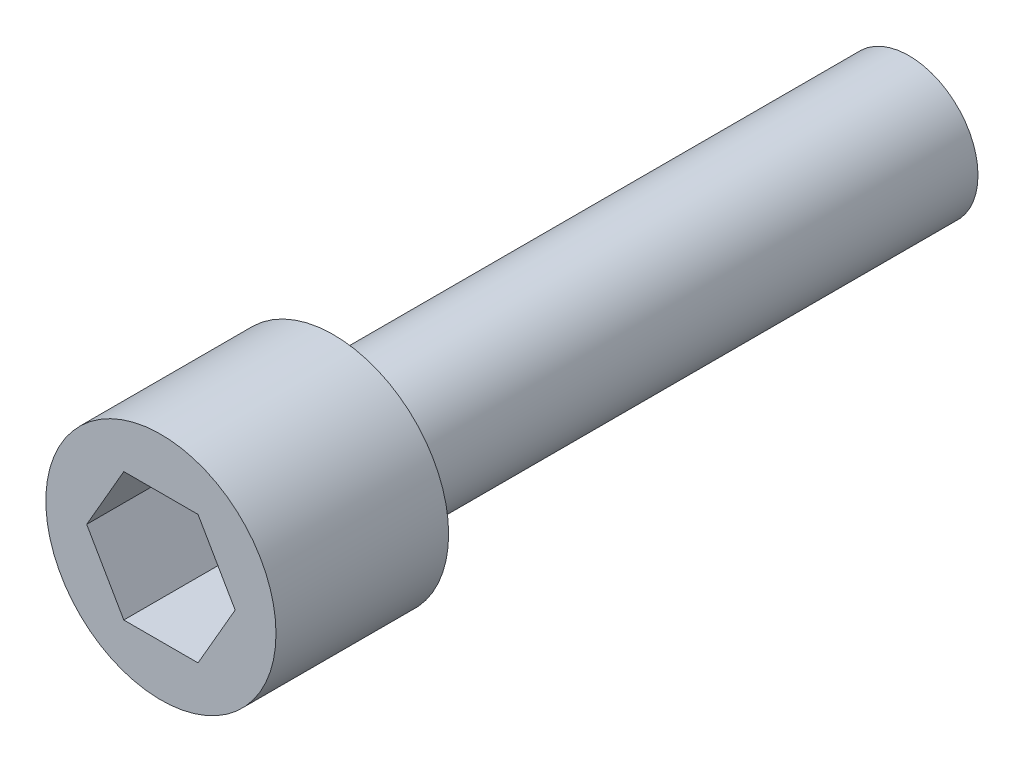
ISO-10303-21;
HEADER;
FILE_DESCRIPTION(('STEP AP214'),'2;1');
FILE_NAME('part.step','',(''),(''),'','','');
FILE_SCHEMA(('AUTOMOTIVE_DESIGN { 1 0 10303 214 1 1 1 1 }'));
ENDSEC;
DATA;
#1=APPLICATION_CONTEXT('core data for automotive mechanical design processes');
#2=APPLICATION_PROTOCOL_DEFINITION('international standard','automotive_design',2000,#1);
#3=PRODUCT_CONTEXT('',#1,'mechanical');
#4=PRODUCT('Part','Part','',(#3));
#5=PRODUCT_RELATED_PRODUCT_CATEGORY('part','',(#4));
#6=PRODUCT_DEFINITION_FORMATION('','',#4);
#7=PRODUCT_DEFINITION_CONTEXT('part definition',#1,'design');
#8=PRODUCT_DEFINITION('design','',#6,#7);
#9=PRODUCT_DEFINITION_SHAPE('','',#8);
#10=(LENGTH_UNIT() NAMED_UNIT(*) SI_UNIT(.MILLI.,.METRE.));
#11=(NAMED_UNIT(*) PLANE_ANGLE_UNIT() SI_UNIT($,.RADIAN.));
#12=(NAMED_UNIT(*) SI_UNIT($,.STERADIAN.) SOLID_ANGLE_UNIT());
#13=UNCERTAINTY_MEASURE_WITH_UNIT(LENGTH_MEASURE(1.E-05),#10,'distance_accuracy_value','');
#14=(GEOMETRIC_REPRESENTATION_CONTEXT(3) GLOBAL_UNCERTAINTY_ASSIGNED_CONTEXT((#13)) GLOBAL_UNIT_ASSIGNED_CONTEXT((#10,
#11,#12)) REPRESENTATION_CONTEXT('',''));
#15=CARTESIAN_POINT('',(0.,0.,0.));
#16=DIRECTION('',(0.,0.,1.));
#17=DIRECTION('',(1.,0.,0.));
#18=AXIS2_PLACEMENT_3D('',#15,#16,#17);
#19=CARTESIAN_POINT('',(-15.,15.,-10.));
#20=DIRECTION('',(0.,0.,1.));
#21=DIRECTION('',(1.,0.,0.));
#22=AXIS2_PLACEMENT_3D('',#19,#20,#21);
#23=CYLINDRICAL_SURFACE('',#22,1.2);
#24=CARTESIAN_POINT('',(-15.,15.,-10.));
#25=DIRECTION('',(0.,0.,1.));
#26=DIRECTION('',(1.,0.,0.));
#27=AXIS2_PLACEMENT_3D('',#24,#25,#26);
#28=CIRCLE('',#27,1.2);
#29=CARTESIAN_POINT('',(-13.8,15.,-10.));
#30=VERTEX_POINT('',#29);
#31=EDGE_CURVE('E11',#30,#30,#28,.T.);
#32=ORIENTED_EDGE('',*,*,#31,.T.);
#33=EDGE_LOOP('',(#32));
#34=FACE_BOUND('',#33,.T.);
#35=CARTESIAN_POINT('',(-15.,15.,0.));
#36=DIRECTION('',(0.,0.,1.));
#37=DIRECTION('',(1.,0.,0.));
#38=AXIS2_PLACEMENT_3D('',#35,#36,#37);
#39=CIRCLE('',#38,1.2);
#40=CARTESIAN_POINT('',(-13.8,15.,0.));
#41=VERTEX_POINT('',#40);
#42=EDGE_CURVE('E38',#41,#41,#39,.T.);
#43=ORIENTED_EDGE('',*,*,#42,.F.);
#44=EDGE_LOOP('',(#43));
#45=FACE_BOUND('',#44,.T.);
#46=ADVANCED_FACE('F35',(#34,#45),#23,.T.);
#47=CARTESIAN_POINT('',(-15.,15.,-10.));
#48=DIRECTION('',(0.,0.,1.));
#49=DIRECTION('',(1.,0.,0.));
#50=AXIS2_PLACEMENT_3D('',#47,#48,#49);
#51=PLANE('',#50);
#52=ORIENTED_EDGE('',*,*,#31,.F.);
#53=EDGE_LOOP('',(#52));
#54=FACE_BOUND('',#53,.T.);
#55=ADVANCED_FACE('F167',(#54),#51,.F.);
#56=CARTESIAN_POINT('',(-15.,15.,3.));
#57=DIRECTION('',(0.,0.,-1.));
#58=DIRECTION('',(-1.,0.,0.));
#59=AXIS2_PLACEMENT_3D('',#56,#57,#58);
#60=CYLINDRICAL_SURFACE('',#59,2.);
#61=CARTESIAN_POINT('',(-15.,15.,3.));
#62=DIRECTION('',(0.,0.,1.));
#63=DIRECTION('',(1.,0.,0.));
#64=AXIS2_PLACEMENT_3D('',#61,#62,#63);
#65=CIRCLE('',#64,2.);
#66=CARTESIAN_POINT('',(-13.,15.,3.));
#67=VERTEX_POINT('',#66);
#68=EDGE_CURVE('E142',#67,#67,#65,.T.);
#69=ORIENTED_EDGE('',*,*,#68,.F.);
#70=EDGE_LOOP('',(#69));
#71=FACE_BOUND('',#70,.T.);
#72=CARTESIAN_POINT('',(-15.,15.,0.));
#73=DIRECTION('',(0.,0.,1.));
#74=DIRECTION('',(1.,0.,0.));
#75=AXIS2_PLACEMENT_3D('',#72,#73,#74);
#76=CIRCLE('',#75,2.);
#77=CARTESIAN_POINT('',(-13.,15.,0.));
#78=VERTEX_POINT('',#77);
#79=EDGE_CURVE('E136',#78,#78,#76,.T.);
#80=ORIENTED_EDGE('',*,*,#79,.T.);
#81=EDGE_LOOP('',(#80));
#82=FACE_BOUND('',#81,.T.);
#83=ADVANCED_FACE('F148',(#71,#82),#60,.T.);
#84=CARTESIAN_POINT('',(-15.,15.,3.));
#85=DIRECTION('',(0.,0.,1.));
#86=DIRECTION('',(1.,0.,0.));
#87=AXIS2_PLACEMENT_3D('',#84,#85,#86);
#88=PLANE('',#87);
#89=DIRECTION('',(0.499999999999995,0.866025403784442,0.));
#90=VECTOR('',#89,1.);
#91=CARTESIAN_POINT('',(-14.3549738433214,13.8827819244218,3.));
#92=LINE('',#91,#90);
#93=CARTESIAN_POINT('',(-14.3549738433214,13.8827819244218,3.));
#94=VERTEX_POINT('',#93);
#95=CARTESIAN_POINT('',(-13.7099476866428,15.,3.));
#96=VERTEX_POINT('',#95);
#97=EDGE_CURVE('E49',#94,#96,#92,.T.);
#98=ORIENTED_EDGE('',*,*,#97,.F.);
#99=DIRECTION('',(1.,0.,0.));
#100=VECTOR('',#99,1.);
#101=CARTESIAN_POINT('',(-15.6450261566786,13.8827819244218,3.));
#102=LINE('',#101,#100);
#103=CARTESIAN_POINT('',(-15.6450261566786,13.8827819244218,3.));
#104=VERTEX_POINT('',#103);
#105=EDGE_CURVE('E132',#104,#94,#102,.T.);
#106=ORIENTED_EDGE('',*,*,#105,.F.);
#107=DIRECTION('',(0.500000000000006,-0.866025403784435,0.));
#108=VECTOR('',#107,1.);
#109=CARTESIAN_POINT('',(-16.2900523133572,15.,3.));
#110=LINE('',#109,#108);
#111=CARTESIAN_POINT('',(-16.2900523133572,15.,3.));
#112=VERTEX_POINT('',#111);
#113=EDGE_CURVE('E130',#112,#104,#110,.T.);
#114=ORIENTED_EDGE('',*,*,#113,.F.);
#115=DIRECTION('',(-0.499999999999995,-0.866025403784442,0.));
#116=VECTOR('',#115,1.);
#117=CARTESIAN_POINT('',(-15.6450261566786,16.1172180755782,3.));
#118=LINE('',#117,#116);
#119=CARTESIAN_POINT('',(-15.6450261566786,16.1172180755782,3.));
#120=VERTEX_POINT('',#119);
#121=EDGE_CURVE('E97',#120,#112,#118,.T.);
#122=ORIENTED_EDGE('',*,*,#121,.F.);
#123=DIRECTION('',(-1.,0.,0.));
#124=VECTOR('',#123,1.);
#125=CARTESIAN_POINT('',(-14.3549738433214,16.1172180755782,3.));
#126=LINE('',#125,#124);
#127=CARTESIAN_POINT('',(-14.3549738433214,16.1172180755782,3.));
#128=VERTEX_POINT('',#127);
#129=EDGE_CURVE('E126',#128,#120,#126,.T.);
#130=ORIENTED_EDGE('',*,*,#129,.F.);
#131=DIRECTION('',(-0.500000000000002,0.866025403784438,0.));
#132=VECTOR('',#131,1.);
#133=CARTESIAN_POINT('',(-13.7099476866428,15.,3.));
#134=LINE('',#133,#132);
#135=EDGE_CURVE('E123',#96,#128,#134,.T.);
#136=ORIENTED_EDGE('',*,*,#135,.F.);
#137=EDGE_LOOP('',(#98,#106,#114,#122,#130,#136));
#138=FACE_BOUND('',#137,.T.);
#139=ORIENTED_EDGE('',*,*,#68,.T.);
#140=EDGE_LOOP('',(#139));
#141=FACE_BOUND('',#140,.T.);
#142=ADVANCED_FACE('F153',(#138,#141),#88,.T.);
#143=CARTESIAN_POINT('',(-15.,15.,0.));
#144=DIRECTION('',(0.,0.,1.));
#145=DIRECTION('',(1.,0.,0.));
#146=AXIS2_PLACEMENT_3D('',#143,#144,#145);
#147=PLANE('',#146);
#148=ORIENTED_EDGE('',*,*,#42,.T.);
#149=EDGE_LOOP('',(#148));
#150=FACE_BOUND('',#149,.T.);
#151=ORIENTED_EDGE('',*,*,#79,.F.);
#152=EDGE_LOOP('',(#151));
#153=FACE_BOUND('',#152,.T.);
#154=ADVANCED_FACE('F150',(#150,#153),#147,.F.);
#155=CARTESIAN_POINT('',(-14.3549738433214,13.8827819244218,1.));
#156=DIRECTION('',(0.866025403784442,-0.499999999999995,0.));
#157=DIRECTION('',(0.499999999999995,0.866025403784442,0.));
#158=AXIS2_PLACEMENT_3D('',#155,#156,#157);
#159=PLANE('',#158);
#160=ORIENTED_EDGE('',*,*,#97,.T.);
#161=DIRECTION('',(0.,0.,1.));
#162=VECTOR('',#161,1.);
#163=CARTESIAN_POINT('',(-13.7099476866428,15.,1.));
#164=LINE('',#163,#162);
#165=CARTESIAN_POINT('',(-13.7099476866428,15.,1.));
#166=VERTEX_POINT('',#165);
#167=EDGE_CURVE('E79',#166,#96,#164,.T.);
#168=ORIENTED_EDGE('',*,*,#167,.F.);
#169=DIRECTION('',(0.499999999999995,0.866025403784442,0.));
#170=VECTOR('',#169,1.);
#171=CARTESIAN_POINT('',(-14.3549738433214,13.8827819244218,1.));
#172=LINE('',#171,#170);
#173=CARTESIAN_POINT('',(-14.3549738433214,13.8827819244218,1.));
#174=VERTEX_POINT('',#173);
#175=EDGE_CURVE('E134',#174,#166,#172,.T.);
#176=ORIENTED_EDGE('',*,*,#175,.F.);
#177=DIRECTION('',(0.,0.,1.));
#178=VECTOR('',#177,1.);
#179=CARTESIAN_POINT('',(-14.3549738433214,13.8827819244218,1.));
#180=LINE('',#179,#178);
#181=EDGE_CURVE('E57',#174,#94,#180,.T.);
#182=ORIENTED_EDGE('',*,*,#181,.T.);
#183=EDGE_LOOP('',(#160,#168,#176,#182));
#184=FACE_BOUND('',#183,.T.);
#185=ADVANCED_FACE('F152',(#184),#159,.F.);
#186=CARTESIAN_POINT('',(-15.6450261566786,13.8827819244218,1.));
#187=DIRECTION('',(0.,-1.,0.));
#188=DIRECTION('',(1.,0.,0.));
#189=AXIS2_PLACEMENT_3D('',#186,#187,#188);
#190=PLANE('',#189);
#191=ORIENTED_EDGE('',*,*,#105,.T.);
#192=ORIENTED_EDGE('',*,*,#181,.F.);
#193=DIRECTION('',(1.,0.,0.));
#194=VECTOR('',#193,1.);
#195=CARTESIAN_POINT('',(-15.6450261566786,13.8827819244218,1.));
#196=LINE('',#195,#194);
#197=CARTESIAN_POINT('',(-15.6450261566786,13.8827819244218,1.));
#198=VERTEX_POINT('',#197);
#199=EDGE_CURVE('E109',#198,#174,#196,.T.);
#200=ORIENTED_EDGE('',*,*,#199,.F.);
#201=DIRECTION('',(0.,0.,1.));
#202=VECTOR('',#201,1.);
#203=CARTESIAN_POINT('',(-15.6450261566786,13.8827819244218,1.));
#204=LINE('',#203,#202);
#205=EDGE_CURVE('E101',#198,#104,#204,.T.);
#206=ORIENTED_EDGE('',*,*,#205,.T.);
#207=EDGE_LOOP('',(#191,#192,#200,#206));
#208=FACE_BOUND('',#207,.T.);
#209=ADVANCED_FACE('F160',(#208),#190,.F.);
#210=CARTESIAN_POINT('',(-16.2900523133572,15.,1.));
#211=DIRECTION('',(-0.866025403784435,-0.500000000000006,0.));
#212=DIRECTION('',(0.500000000000006,-0.866025403784435,0.));
#213=AXIS2_PLACEMENT_3D('',#210,#211,#212);
#214=PLANE('',#213);
#215=ORIENTED_EDGE('',*,*,#113,.T.);
#216=ORIENTED_EDGE('',*,*,#205,.F.);
#217=DIRECTION('',(0.500000000000006,-0.866025403784435,0.));
#218=VECTOR('',#217,1.);
#219=CARTESIAN_POINT('',(-16.2900523133572,15.,1.));
#220=LINE('',#219,#218);
#221=CARTESIAN_POINT('',(-16.2900523133572,15.,1.));
#222=VERTEX_POINT('',#221);
#223=EDGE_CURVE('E105',#222,#198,#220,.T.);
#224=ORIENTED_EDGE('',*,*,#223,.F.);
#225=DIRECTION('',(0.,0.,1.));
#226=VECTOR('',#225,1.);
#227=CARTESIAN_POINT('',(-16.2900523133572,15.,1.));
#228=LINE('',#227,#226);
#229=EDGE_CURVE('E90',#222,#112,#228,.T.);
#230=ORIENTED_EDGE('',*,*,#229,.T.);
#231=EDGE_LOOP('',(#215,#216,#224,#230));
#232=FACE_BOUND('',#231,.T.);
#233=ADVANCED_FACE('F106',(#232),#214,.F.);
#234=CARTESIAN_POINT('',(-15.6450261566786,16.1172180755782,1.));
#235=DIRECTION('',(-0.866025403784442,0.499999999999995,0.));
#236=DIRECTION('',(-0.499999999999995,-0.866025403784442,0.));
#237=AXIS2_PLACEMENT_3D('',#234,#235,#236);
#238=PLANE('',#237);
#239=ORIENTED_EDGE('',*,*,#121,.T.);
#240=ORIENTED_EDGE('',*,*,#229,.F.);
#241=DIRECTION('',(-0.499999999999995,-0.866025403784442,0.));
#242=VECTOR('',#241,1.);
#243=CARTESIAN_POINT('',(-15.6450261566786,16.1172180755782,1.));
#244=LINE('',#243,#242);
#245=CARTESIAN_POINT('',(-15.6450261566786,16.1172180755782,1.));
#246=VERTEX_POINT('',#245);
#247=EDGE_CURVE('E94',#246,#222,#244,.T.);
#248=ORIENTED_EDGE('',*,*,#247,.F.);
#249=DIRECTION('',(0.,0.,1.));
#250=VECTOR('',#249,1.);
#251=CARTESIAN_POINT('',(-15.6450261566786,16.1172180755782,1.));
#252=LINE('',#251,#250);
#253=EDGE_CURVE('E102',#246,#120,#252,.T.);
#254=ORIENTED_EDGE('',*,*,#253,.T.);
#255=EDGE_LOOP('',(#239,#240,#248,#254));
#256=FACE_BOUND('',#255,.T.);
#257=ADVANCED_FACE('F92',(#256),#238,.F.);
#258=CARTESIAN_POINT('',(-14.3549738433214,16.1172180755782,1.));
#259=DIRECTION('',(0.,1.,0.));
#260=DIRECTION('',(-1.,0.,0.));
#261=AXIS2_PLACEMENT_3D('',#258,#259,#260);
#262=PLANE('',#261);
#263=ORIENTED_EDGE('',*,*,#129,.T.);
#264=ORIENTED_EDGE('',*,*,#253,.F.);
#265=DIRECTION('',(-1.,0.,0.));
#266=VECTOR('',#265,1.);
#267=CARTESIAN_POINT('',(-14.3549738433214,16.1172180755782,1.));
#268=LINE('',#267,#266);
#269=CARTESIAN_POINT('',(-14.3549738433214,16.1172180755782,1.));
#270=VERTEX_POINT('',#269);
#271=EDGE_CURVE('E115',#270,#246,#268,.T.);
#272=ORIENTED_EDGE('',*,*,#271,.F.);
#273=DIRECTION('',(0.,0.,1.));
#274=VECTOR('',#273,1.);
#275=CARTESIAN_POINT('',(-14.3549738433214,16.1172180755782,1.));
#276=LINE('',#275,#274);
#277=EDGE_CURVE('E139',#270,#128,#276,.T.);
#278=ORIENTED_EDGE('',*,*,#277,.T.);
#279=EDGE_LOOP('',(#263,#264,#272,#278));
#280=FACE_BOUND('',#279,.T.);
#281=ADVANCED_FACE('F221',(#280),#262,.F.);
#282=CARTESIAN_POINT('',(-13.7099476866428,15.,1.));
#283=DIRECTION('',(0.866025403784438,0.500000000000002,0.));
#284=DIRECTION('',(-0.500000000000002,0.866025403784438,0.));
#285=AXIS2_PLACEMENT_3D('',#282,#283,#284);
#286=PLANE('',#285);
#287=ORIENTED_EDGE('',*,*,#135,.T.);
#288=ORIENTED_EDGE('',*,*,#277,.F.);
#289=DIRECTION('',(-0.500000000000002,0.866025403784438,0.));
#290=VECTOR('',#289,1.);
#291=CARTESIAN_POINT('',(-13.7099476866428,15.,1.));
#292=LINE('',#291,#290);
#293=EDGE_CURVE('E117',#166,#270,#292,.T.);
#294=ORIENTED_EDGE('',*,*,#293,.F.);
#295=ORIENTED_EDGE('',*,*,#167,.T.);
#296=EDGE_LOOP('',(#287,#288,#294,#295));
#297=FACE_BOUND('',#296,.T.);
#298=ADVANCED_FACE('F230',(#297),#286,.F.);
#299=CARTESIAN_POINT('',(0.,0.,1.));
#300=DIRECTION('',(0.,0.,1.));
#301=DIRECTION('',(1.,0.,0.));
#302=AXIS2_PLACEMENT_3D('',#299,#300,#301);
#303=PLANE('',#302);
#304=ORIENTED_EDGE('',*,*,#175,.T.);
#305=ORIENTED_EDGE('',*,*,#293,.T.);
#306=ORIENTED_EDGE('',*,*,#271,.T.);
#307=ORIENTED_EDGE('',*,*,#247,.T.);
#308=ORIENTED_EDGE('',*,*,#223,.T.);
#309=ORIENTED_EDGE('',*,*,#199,.T.);
#310=EDGE_LOOP('',(#304,#305,#306,#307,#308,#309));
#311=FACE_BOUND('',#310,.T.);
#312=ADVANCED_FACE('F112',(#311),#303,.T.);
#313=CLOSED_SHELL('',(#46,#55,#83,#142,#154,#185,#209,#233,#257,#281,#298,#312));
#314=MANIFOLD_SOLID_BREP('B2',#313);
#315=ADVANCED_BREP_SHAPE_REPRESENTATION('',(#18,#314),#14);
#316=SHAPE_DEFINITION_REPRESENTATION(#9,#315);
ENDSEC;
END-ISO-10303-21;
